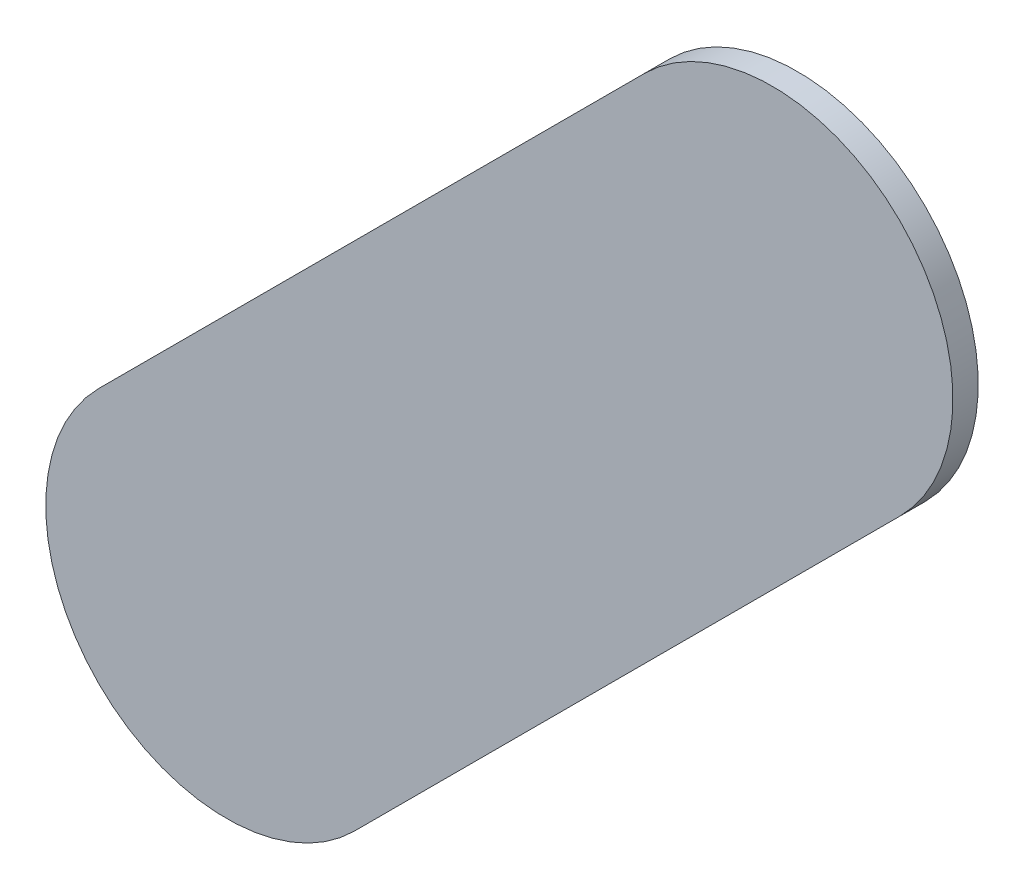
ISO-10303-21;
HEADER;
FILE_DESCRIPTION(('STEP AP214'),'2;1');
FILE_NAME('part.step','',(''),(''),'','','');
FILE_SCHEMA(('AUTOMOTIVE_DESIGN { 1 0 10303 214 1 1 1 1 }'));
ENDSEC;
DATA;
#1=APPLICATION_CONTEXT('core data for automotive mechanical design processes');
#2=APPLICATION_PROTOCOL_DEFINITION('international standard','automotive_design',2000,#1);
#3=PRODUCT_CONTEXT('',#1,'mechanical');
#4=PRODUCT('Part','Part','',(#3));
#5=PRODUCT_RELATED_PRODUCT_CATEGORY('part','',(#4));
#6=PRODUCT_DEFINITION_FORMATION('','',#4);
#7=PRODUCT_DEFINITION_CONTEXT('part definition',#1,'design');
#8=PRODUCT_DEFINITION('design','',#6,#7);
#9=PRODUCT_DEFINITION_SHAPE('','',#8);
#10=(LENGTH_UNIT() NAMED_UNIT(*) SI_UNIT(.MILLI.,.METRE.));
#11=(NAMED_UNIT(*) PLANE_ANGLE_UNIT() SI_UNIT($,.RADIAN.));
#12=(NAMED_UNIT(*) SI_UNIT($,.STERADIAN.) SOLID_ANGLE_UNIT());
#13=UNCERTAINTY_MEASURE_WITH_UNIT(LENGTH_MEASURE(1.E-05),#10,'distance_accuracy_value','');
#14=(GEOMETRIC_REPRESENTATION_CONTEXT(3) GLOBAL_UNCERTAINTY_ASSIGNED_CONTEXT((#13)) GLOBAL_UNIT_ASSIGNED_CONTEXT((#10,
#11,#12)) REPRESENTATION_CONTEXT('',''));
#15=CARTESIAN_POINT('',(0.,0.,0.));
#16=DIRECTION('',(0.,0.,1.));
#17=DIRECTION('',(1.,0.,0.));
#18=AXIS2_PLACEMENT_3D('',#15,#16,#17);
#19=CARTESIAN_POINT('',(121.103223,-68.343223,1.635));
#20=DIRECTION('',(0.,0.,1.));
#21=DIRECTION('',(1.,0.,0.));
#22=AXIS2_PLACEMENT_3D('',#19,#20,#21);
#23=PLANE('',#22);
#24=DIRECTION('',(-0.707106781186548,-0.707106781186548,0.));
#25=VECTOR('',#24,1.);
#26=CARTESIAN_POINT('',(121.103223,-68.343223,1.635));
#27=LINE('',#26,#25);
#28=CARTESIAN_POINT('',(121.103223,-68.343223,1.635));
#29=VERTEX_POINT('',#28);
#30=CARTESIAN_POINT('',(120.348223,-69.098223,1.635));
#31=VERTEX_POINT('',#30);
#32=EDGE_CURVE('E71',#29,#31,#27,.T.);
#33=ORIENTED_EDGE('',*,*,#32,.T.);
#34=CARTESIAN_POINT('',(120.5249995,-69.2749995,1.635));
#35=DIRECTION('',(0.,0.,1.));
#36=DIRECTION('',(-0.707106781186548,0.707106781186548,0.));
#37=AXIS2_PLACEMENT_3D('',#34,#35,#36);
#38=CIRCLE('',#37,0.249999723809);
#39=CARTESIAN_POINT('',(120.701776,-69.451776,1.635));
#40=VERTEX_POINT('',#39);
#41=EDGE_CURVE('E103',#31,#40,#38,.T.);
#42=ORIENTED_EDGE('',*,*,#41,.T.);
#43=DIRECTION('',(0.707106781186548,0.707106781186548,0.));
#44=VECTOR('',#43,1.);
#45=CARTESIAN_POINT('',(120.701776,-69.451776,1.635));
#46=LINE('',#45,#44);
#47=CARTESIAN_POINT('',(121.456776,-68.696776,1.635));
#48=VERTEX_POINT('',#47);
#49=EDGE_CURVE('E73',#40,#48,#46,.T.);
#50=ORIENTED_EDGE('',*,*,#49,.T.);
#51=CARTESIAN_POINT('',(121.2799995,-68.5199995,1.635));
#52=DIRECTION('',(0.,0.,1.));
#53=DIRECTION('',(0.707106781186548,-0.707106781186548,0.));
#54=AXIS2_PLACEMENT_3D('',#51,#52,#53);
#55=CIRCLE('',#54,0.249999723809);
#56=EDGE_CURVE('E11',#48,#29,#55,.T.);
#57=ORIENTED_EDGE('',*,*,#56,.T.);
#58=EDGE_LOOP('',(#33,#42,#50,#57));
#59=FACE_BOUND('',#58,.T.);
#60=ADVANCED_FACE('F17',(#59),#23,.T.);
#61=CARTESIAN_POINT('',(121.103223,-68.343223,1.6));
#62=DIRECTION('',(0.,0.,1.));
#63=DIRECTION('',(1.,0.,0.));
#64=AXIS2_PLACEMENT_3D('',#61,#62,#63);
#65=PLANE('',#64);
#66=CARTESIAN_POINT('',(121.2799995,-68.5199995,1.6));
#67=DIRECTION('',(0.,0.,1.));
#68=DIRECTION('',(0.707106781186548,-0.707106781186548,0.));
#69=AXIS2_PLACEMENT_3D('',#66,#67,#68);
#70=CIRCLE('',#69,0.249999723809);
#71=CARTESIAN_POINT('',(121.456776,-68.696776,1.6));
#72=VERTEX_POINT('',#71);
#73=CARTESIAN_POINT('',(121.103223,-68.343223,1.6));
#74=VERTEX_POINT('',#73);
#75=EDGE_CURVE('E20',#72,#74,#70,.T.);
#76=ORIENTED_EDGE('',*,*,#75,.F.);
#77=DIRECTION('',(0.707106781186548,0.707106781186548,0.));
#78=VECTOR('',#77,1.);
#79=CARTESIAN_POINT('',(120.701776,-69.451776,1.6));
#80=LINE('',#79,#78);
#81=CARTESIAN_POINT('',(120.701776,-69.451776,1.6));
#82=VERTEX_POINT('',#81);
#83=EDGE_CURVE('E107',#82,#72,#80,.T.);
#84=ORIENTED_EDGE('',*,*,#83,.F.);
#85=CARTESIAN_POINT('',(120.5249995,-69.2749995,1.6));
#86=DIRECTION('',(0.,0.,1.));
#87=DIRECTION('',(-0.707106781186548,0.707106781186548,0.));
#88=AXIS2_PLACEMENT_3D('',#85,#86,#87);
#89=CIRCLE('',#88,0.249999723809);
#90=CARTESIAN_POINT('',(120.348223,-69.098223,1.6));
#91=VERTEX_POINT('',#90);
#92=EDGE_CURVE('E81',#91,#82,#89,.T.);
#93=ORIENTED_EDGE('',*,*,#92,.F.);
#94=DIRECTION('',(-0.707106781186548,-0.707106781186548,0.));
#95=VECTOR('',#94,1.);
#96=CARTESIAN_POINT('',(121.103223,-68.343223,1.6));
#97=LINE('',#96,#95);
#98=EDGE_CURVE('E92',#74,#91,#97,.T.);
#99=ORIENTED_EDGE('',*,*,#98,.F.);
#100=EDGE_LOOP('',(#76,#84,#93,#99));
#101=FACE_BOUND('',#100,.T.);
#102=ADVANCED_FACE('F116',(#101),#65,.F.);
#103=CARTESIAN_POINT('',(121.2799995,-68.5199995,1.6));
#104=DIRECTION('',(0.,0.,-1.));
#105=DIRECTION('',(0.707106781186548,-0.707106781186548,0.));
#106=AXIS2_PLACEMENT_3D('',#103,#104,#105);
#107=CYLINDRICAL_SURFACE('',#106,0.249999723809);
#108=ORIENTED_EDGE('',*,*,#75,.T.);
#109=DIRECTION('',(0.,0.,1.));
#110=VECTOR('',#109,1.);
#111=CARTESIAN_POINT('',(121.103223,-68.343223,1.6));
#112=LINE('',#111,#110);
#113=EDGE_CURVE('E76',#74,#29,#112,.T.);
#114=ORIENTED_EDGE('',*,*,#113,.T.);
#115=ORIENTED_EDGE('',*,*,#56,.F.);
#116=DIRECTION('',(0.,0.,1.));
#117=VECTOR('',#116,1.);
#118=CARTESIAN_POINT('',(121.456776,-68.696776,1.6));
#119=LINE('',#118,#117);
#120=EDGE_CURVE('E104',#72,#48,#119,.T.);
#121=ORIENTED_EDGE('',*,*,#120,.F.);
#122=EDGE_LOOP('',(#108,#114,#115,#121));
#123=FACE_BOUND('',#122,.T.);
#124=ADVANCED_FACE('F77',(#123),#107,.T.);
#125=CARTESIAN_POINT('',(120.701776,-69.451776,1.6));
#126=DIRECTION('',(-0.707106781186548,0.707106781186548,0.));
#127=DIRECTION('',(0.,0.,1.));
#128=AXIS2_PLACEMENT_3D('',#125,#126,#127);
#129=PLANE('',#128);
#130=ORIENTED_EDGE('',*,*,#83,.T.);
#131=ORIENTED_EDGE('',*,*,#120,.T.);
#132=ORIENTED_EDGE('',*,*,#49,.F.);
#133=DIRECTION('',(0.,0.,1.));
#134=VECTOR('',#133,1.);
#135=CARTESIAN_POINT('',(120.701776,-69.451776,1.6));
#136=LINE('',#135,#134);
#137=EDGE_CURVE('E98',#82,#40,#136,.T.);
#138=ORIENTED_EDGE('',*,*,#137,.F.);
#139=EDGE_LOOP('',(#130,#131,#132,#138));
#140=FACE_BOUND('',#139,.T.);
#141=ADVANCED_FACE('F115',(#140),#129,.F.);
#142=CARTESIAN_POINT('',(120.5249995,-69.2749995,1.6));
#143=DIRECTION('',(0.,0.,-1.));
#144=DIRECTION('',(-0.707106781186548,0.707106781186548,0.));
#145=AXIS2_PLACEMENT_3D('',#142,#143,#144);
#146=CYLINDRICAL_SURFACE('',#145,0.249999723809);
#147=ORIENTED_EDGE('',*,*,#92,.T.);
#148=ORIENTED_EDGE('',*,*,#137,.T.);
#149=ORIENTED_EDGE('',*,*,#41,.F.);
#150=DIRECTION('',(0.,0.,1.));
#151=VECTOR('',#150,1.);
#152=CARTESIAN_POINT('',(120.348223,-69.098223,1.6));
#153=LINE('',#152,#151);
#154=EDGE_CURVE('E85',#91,#31,#153,.T.);
#155=ORIENTED_EDGE('',*,*,#154,.F.);
#156=EDGE_LOOP('',(#147,#148,#149,#155));
#157=FACE_BOUND('',#156,.T.);
#158=ADVANCED_FACE('F118',(#157),#146,.T.);
#159=CARTESIAN_POINT('',(121.103223,-68.343223,1.6));
#160=DIRECTION('',(0.707106781186548,-0.707106781186548,0.));
#161=DIRECTION('',(0.,0.,-1.));
#162=AXIS2_PLACEMENT_3D('',#159,#160,#161);
#163=PLANE('',#162);
#164=ORIENTED_EDGE('',*,*,#98,.T.);
#165=ORIENTED_EDGE('',*,*,#154,.T.);
#166=ORIENTED_EDGE('',*,*,#32,.F.);
#167=ORIENTED_EDGE('',*,*,#113,.F.);
#168=EDGE_LOOP('',(#164,#165,#166,#167));
#169=FACE_BOUND('',#168,.T.);
#170=ADVANCED_FACE('F83',(#169),#163,.F.);
#171=CLOSED_SHELL('',(#60,#102,#124,#141,#158,#170));
#172=MANIFOLD_SOLID_BREP('B1',#171);
#173=ADVANCED_BREP_SHAPE_REPRESENTATION('',(#18,#172),#14);
#174=SHAPE_DEFINITION_REPRESENTATION(#9,#173);
ENDSEC;
END-ISO-10303-21;
